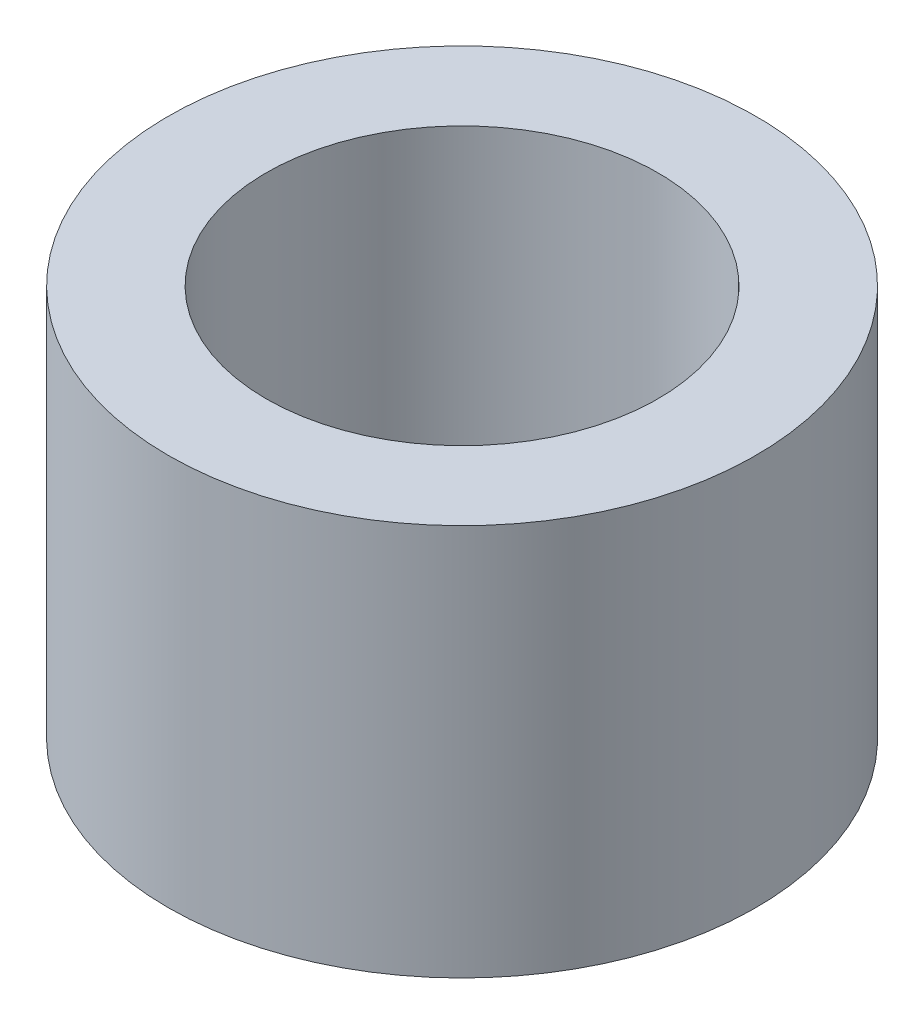
ISO-10303-21;
HEADER;
FILE_DESCRIPTION(('STEP AP214'),'2;1');
FILE_NAME('part.step','',(''),(''),'','','');
FILE_SCHEMA(('AUTOMOTIVE_DESIGN { 1 0 10303 214 1 1 1 1 }'));
ENDSEC;
DATA;
#1=APPLICATION_CONTEXT('core data for automotive mechanical design processes');
#2=APPLICATION_PROTOCOL_DEFINITION('international standard','automotive_design',2000,#1);
#3=PRODUCT_CONTEXT('',#1,'mechanical');
#4=PRODUCT('Part','Part','',(#3));
#5=PRODUCT_RELATED_PRODUCT_CATEGORY('part','',(#4));
#6=PRODUCT_DEFINITION_FORMATION('','',#4);
#7=PRODUCT_DEFINITION_CONTEXT('part definition',#1,'design');
#8=PRODUCT_DEFINITION('design','',#6,#7);
#9=PRODUCT_DEFINITION_SHAPE('','',#8);
#10=(LENGTH_UNIT() NAMED_UNIT(*) SI_UNIT(.MILLI.,.METRE.));
#11=(NAMED_UNIT(*) PLANE_ANGLE_UNIT() SI_UNIT($,.RADIAN.));
#12=(NAMED_UNIT(*) SI_UNIT($,.STERADIAN.) SOLID_ANGLE_UNIT());
#13=UNCERTAINTY_MEASURE_WITH_UNIT(LENGTH_MEASURE(1.E-05),#10,'distance_accuracy_value','');
#14=(GEOMETRIC_REPRESENTATION_CONTEXT(3) GLOBAL_UNCERTAINTY_ASSIGNED_CONTEXT((#13)) GLOBAL_UNIT_ASSIGNED_CONTEXT((#10,
#11,#12)) REPRESENTATION_CONTEXT('',''));
#15=CARTESIAN_POINT('',(0.,0.,0.));
#16=DIRECTION('',(0.,0.,1.));
#17=DIRECTION('',(1.,0.,0.));
#18=AXIS2_PLACEMENT_3D('',#15,#16,#17);
#19=CARTESIAN_POINT('',(0.,5.08,0.));
#20=DIRECTION('',(0.,1.,0.));
#21=DIRECTION('',(0.,0.,1.));
#22=AXIS2_PLACEMENT_3D('',#19,#20,#21);
#23=PLANE('',#22);
#24=CARTESIAN_POINT('',(0.,5.08,0.));
#25=DIRECTION('',(0.,1.,0.));
#26=DIRECTION('',(0.,0.,1.));
#27=AXIS2_PLACEMENT_3D('',#24,#25,#26);
#28=CIRCLE('',#27,3.81);
#29=CARTESIAN_POINT('',(0.,5.08,3.81));
#30=VERTEX_POINT('',#29);
#31=EDGE_CURVE('E10',#30,#30,#28,.T.);
#32=ORIENTED_EDGE('',*,*,#31,.T.);
#33=EDGE_LOOP('',(#32));
#34=FACE_BOUND('',#33,.T.);
#35=CARTESIAN_POINT('',(0.,5.08,0.));
#36=DIRECTION('',(0.,1.,0.));
#37=DIRECTION('',(0.,0.,1.));
#38=AXIS2_PLACEMENT_3D('',#35,#36,#37);
#39=CIRCLE('',#38,2.54);
#40=CARTESIAN_POINT('',(0.,5.08,2.54));
#41=VERTEX_POINT('',#40);
#42=EDGE_CURVE('E50',#41,#41,#39,.T.);
#43=ORIENTED_EDGE('',*,*,#42,.F.);
#44=EDGE_LOOP('',(#43));
#45=FACE_BOUND('',#44,.T.);
#46=ADVANCED_FACE('F37',(#34,#45),#23,.T.);
#47=CARTESIAN_POINT('',(0.,0.,0.));
#48=DIRECTION('',(0.,1.,0.));
#49=DIRECTION('',(0.,0.,1.));
#50=AXIS2_PLACEMENT_3D('',#47,#48,#49);
#51=PLANE('',#50);
#52=CARTESIAN_POINT('',(0.,0.,0.));
#53=DIRECTION('',(0.,1.,0.));
#54=DIRECTION('',(0.,0.,1.));
#55=AXIS2_PLACEMENT_3D('',#52,#53,#54);
#56=CIRCLE('',#55,3.81);
#57=CARTESIAN_POINT('',(0.,0.,3.81));
#58=VERTEX_POINT('',#57);
#59=EDGE_CURVE('E41',#58,#58,#56,.T.);
#60=ORIENTED_EDGE('',*,*,#59,.F.);
#61=EDGE_LOOP('',(#60));
#62=FACE_BOUND('',#61,.T.);
#63=CARTESIAN_POINT('',(0.,0.,0.));
#64=DIRECTION('',(0.,1.,0.));
#65=DIRECTION('',(0.,0.,1.));
#66=AXIS2_PLACEMENT_3D('',#63,#64,#65);
#67=CIRCLE('',#66,2.54);
#68=CARTESIAN_POINT('',(0.,0.,2.54));
#69=VERTEX_POINT('',#68);
#70=EDGE_CURVE('E52',#69,#69,#67,.T.);
#71=ORIENTED_EDGE('',*,*,#70,.T.);
#72=EDGE_LOOP('',(#71));
#73=FACE_BOUND('',#72,.T.);
#74=ADVANCED_FACE('F64',(#62,#73),#51,.F.);
#75=CARTESIAN_POINT('',(0.,5.08,0.));
#76=DIRECTION('',(0.,-1.,0.));
#77=DIRECTION('',(0.,0.,-1.));
#78=AXIS2_PLACEMENT_3D('',#75,#76,#77);
#79=CYLINDRICAL_SURFACE('',#78,3.81);
#80=ORIENTED_EDGE('',*,*,#31,.F.);
#81=EDGE_LOOP('',(#80));
#82=FACE_BOUND('',#81,.T.);
#83=ORIENTED_EDGE('',*,*,#59,.T.);
#84=EDGE_LOOP('',(#83));
#85=FACE_BOUND('',#84,.T.);
#86=ADVANCED_FACE('F39',(#82,#85),#79,.T.);
#87=CARTESIAN_POINT('',(0.,5.08,0.));
#88=DIRECTION('',(0.,-1.,0.));
#89=DIRECTION('',(0.,0.,-1.));
#90=AXIS2_PLACEMENT_3D('',#87,#88,#89);
#91=CYLINDRICAL_SURFACE('',#90,2.54);
#92=ORIENTED_EDGE('',*,*,#42,.T.);
#93=EDGE_LOOP('',(#92));
#94=FACE_BOUND('',#93,.T.);
#95=ORIENTED_EDGE('',*,*,#70,.F.);
#96=EDGE_LOOP('',(#95));
#97=FACE_BOUND('',#96,.T.);
#98=ADVANCED_FACE('F60',(#94,#97),#91,.F.);
#99=CLOSED_SHELL('',(#46,#74,#86,#98));
#100=MANIFOLD_SOLID_BREP('B2',#99);
#101=ADVANCED_BREP_SHAPE_REPRESENTATION('',(#18,#100),#14);
#102=SHAPE_DEFINITION_REPRESENTATION(#9,#101);
ENDSEC;
END-ISO-10303-21;
